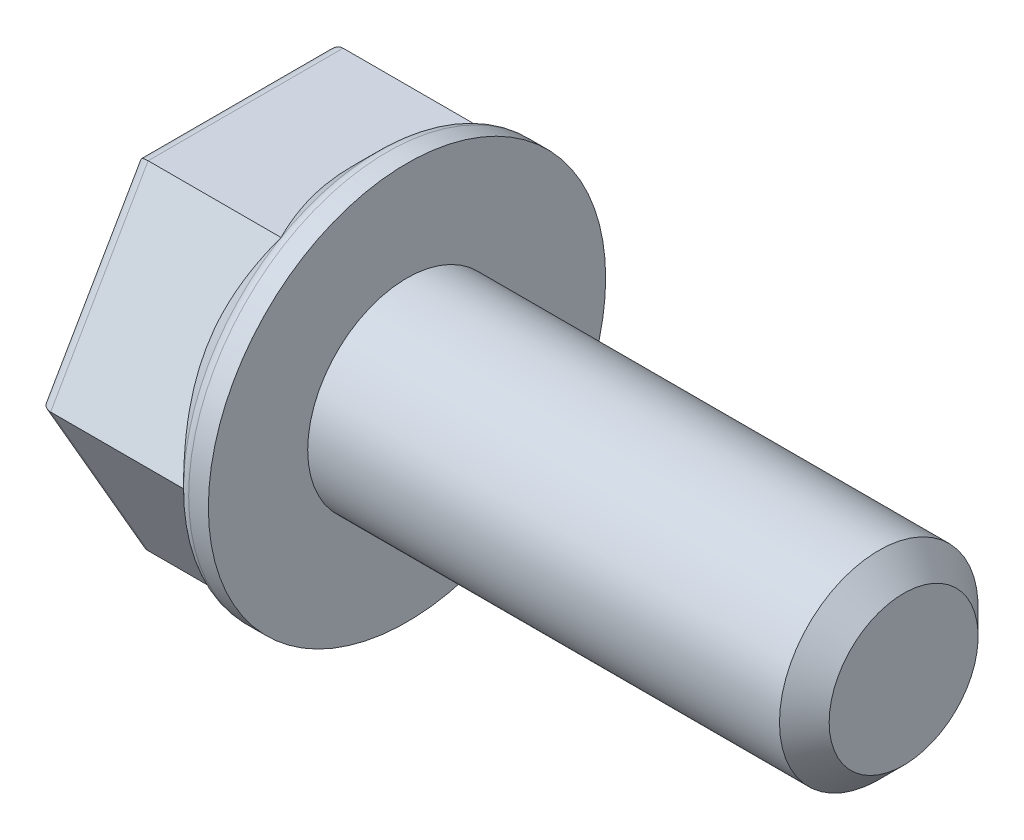
ISO-10303-21;
HEADER;
FILE_DESCRIPTION(('STEP AP214'),'2;1');
FILE_NAME('part.step','',(''),(''),'','','');
FILE_SCHEMA(('AUTOMOTIVE_DESIGN { 1 0 10303 214 1 1 1 1 }'));
ENDSEC;
DATA;
#1=APPLICATION_CONTEXT('core data for automotive mechanical design processes');
#2=APPLICATION_PROTOCOL_DEFINITION('international standard','automotive_design',2000,#1);
#3=PRODUCT_CONTEXT('',#1,'mechanical');
#4=PRODUCT('Part','Part','',(#3));
#5=PRODUCT_RELATED_PRODUCT_CATEGORY('part','',(#4));
#6=PRODUCT_DEFINITION_FORMATION('','',#4);
#7=PRODUCT_DEFINITION_CONTEXT('part definition',#1,'design');
#8=PRODUCT_DEFINITION('design','',#6,#7);
#9=PRODUCT_DEFINITION_SHAPE('','',#8);
#10=(LENGTH_UNIT() NAMED_UNIT(*) SI_UNIT(.MILLI.,.METRE.));
#11=(NAMED_UNIT(*) PLANE_ANGLE_UNIT() SI_UNIT($,.RADIAN.));
#12=(NAMED_UNIT(*) SI_UNIT($,.STERADIAN.) SOLID_ANGLE_UNIT());
#13=UNCERTAINTY_MEASURE_WITH_UNIT(LENGTH_MEASURE(1.E-05),#10,'distance_accuracy_value','');
#14=(GEOMETRIC_REPRESENTATION_CONTEXT(3) GLOBAL_UNCERTAINTY_ASSIGNED_CONTEXT((#13)) GLOBAL_UNIT_ASSIGNED_CONTEXT((#10,
#11,#12)) REPRESENTATION_CONTEXT('',''));
#15=CARTESIAN_POINT('',(0.,0.,0.));
#16=DIRECTION('',(0.,0.,1.));
#17=DIRECTION('',(1.,0.,0.));
#18=AXIS2_PLACEMENT_3D('',#15,#16,#17);
#19=CARTESIAN_POINT('',(-3.5,0.,0.));
#20=DIRECTION('',(-1.,0.,0.));
#21=DIRECTION('',(0.,0.,1.));
#22=AXIS2_PLACEMENT_3D('',#19,#20,#21);
#23=PLANE('',#22);
#24=CARTESIAN_POINT('',(-3.5,0.,0.));
#25=DIRECTION('',(-1.,0.,0.));
#26=DIRECTION('',(0.,0.,1.));
#27=AXIS2_PLACEMENT_3D('',#24,#25,#26);
#28=CIRCLE('',#27,3.10355339059328);
#29=CARTESIAN_POINT('',(-3.5,0.,3.10355339059328));
#30=VERTEX_POINT('',#29);
#31=EDGE_CURVE('E228',#30,#30,#28,.F.);
#32=ORIENTED_EDGE('',*,*,#31,.T.);
#33=EDGE_LOOP('',(#32));
#34=FACE_BOUND('',#33,.T.);
#35=DIRECTION('',(0.,0.,-1.));
#36=VECTOR('',#35,1.);
#37=CARTESIAN_POINT('',(-3.5,3.15000000000002,0.));
#38=LINE('',#37,#36);
#39=CARTESIAN_POINT('',(-3.5,3.15,1.81865334794732));
#40=VERTEX_POINT('',#39);
#41=CARTESIAN_POINT('',(-3.5,3.15000000000004,-1.81865334794721));
#42=VERTEX_POINT('',#41);
#43=EDGE_CURVE('E223',#40,#42,#38,.T.);
#44=ORIENTED_EDGE('',*,*,#43,.T.);
#45=DIRECTION('',(0.,0.866025403784432,0.500000000000012));
#46=VECTOR('',#45,1.);
#47=CARTESIAN_POINT('',(-3.5,-0.125000000000003,-3.70947547954332));
#48=LINE('',#47,#46);
#49=CARTESIAN_POINT('',(-3.5,0.,-3.63730669589461));
#50=VERTEX_POINT('',#49);
#51=EDGE_CURVE('E225',#42,#50,#48,.F.);
#52=ORIENTED_EDGE('',*,*,#51,.T.);
#53=DIRECTION('',(0.,-0.866025403784432,0.500000000000012));
#54=VECTOR('',#53,1.);
#55=CARTESIAN_POINT('',(-3.5,-1.57500000000001,-2.72798002192092));
#56=LINE('',#55,#54);
#57=CARTESIAN_POINT('',(-3.5,-3.15000000000004,-1.81865334794721));
#58=VERTEX_POINT('',#57);
#59=EDGE_CURVE('E209',#50,#58,#56,.T.);
#60=ORIENTED_EDGE('',*,*,#59,.T.);
#61=DIRECTION('',(0.,0.,-1.));
#62=VECTOR('',#61,1.);
#63=CARTESIAN_POINT('',(-3.5,-3.15,1.96299091524473));
#64=LINE('',#63,#62);
#65=CARTESIAN_POINT('',(-3.5,-3.15,1.81865334794732));
#66=VERTEX_POINT('',#65);
#67=EDGE_CURVE('E212',#58,#66,#64,.F.);
#68=ORIENTED_EDGE('',*,*,#67,.T.);
#69=DIRECTION('',(0.,-0.86602540378444,-0.499999999999998));
#70=VECTOR('',#69,1.);
#71=CARTESIAN_POINT('',(-3.5,0.125,3.70947547954334));
#72=LINE('',#71,#70);
#73=CARTESIAN_POINT('',(-3.5,0.,3.63730669589464));
#74=VERTEX_POINT('',#73);
#75=EDGE_CURVE('E219',#66,#74,#72,.F.);
#76=ORIENTED_EDGE('',*,*,#75,.T.);
#77=DIRECTION('',(0.,0.86602540378444,-0.499999999999998));
#78=VECTOR('',#77,1.);
#79=CARTESIAN_POINT('',(-3.5,1.57499999999999,2.72798002192098));
#80=LINE('',#79,#78);
#81=EDGE_CURVE('E221',#74,#40,#80,.T.);
#82=ORIENTED_EDGE('',*,*,#81,.T.);
#83=EDGE_LOOP('',(#44,#52,#60,#68,#76,#82));
#84=FACE_BOUND('',#83,.T.);
#85=ADVANCED_FACE('F33',(#34,#84),#23,.T.);
#86=CARTESIAN_POINT('',(-1.5,0.,0.));
#87=DIRECTION('',(1.,0.,0.));
#88=DIRECTION('',(0.,0.,-1.));
#89=AXIS2_PLACEMENT_3D('',#86,#87,#88);
#90=CONICAL_SURFACE('',#89,3.,0.785398163397448);
#91=CARTESIAN_POINT('',(-0.573223304703364,0.,0.));
#92=DIRECTION('',(-1.,0.,0.));
#93=DIRECTION('',(0.,0.,1.));
#94=AXIS2_PLACEMENT_3D('',#91,#92,#93);
#95=CIRCLE('',#94,3.92677669529664);
#96=CARTESIAN_POINT('',(-0.573223304703364,0.,3.92677669529664));
#97=VERTEX_POINT('',#96);
#98=EDGE_CURVE('E42',#97,#97,#95,.T.);
#99=ORIENTED_EDGE('',*,*,#98,.T.);
#100=EDGE_LOOP('',(#99));
#101=FACE_BOUND('',#100,.T.);
#102=CARTESIAN_POINT('',(-0.573902694362622,0.0002,-3.92609730054327));
#103=CARTESIAN_POINT('',(-0.641319758876492,-0.116671709239921,-3.85862138775294));
#104=CARTESIAN_POINT('',(-0.704777190544404,-0.23549764934872,-3.79001719924442));
#105=CARTESIAN_POINT('',(-0.820966008889542,-0.47779664226543,-3.65012581045957));
#106=CARTESIAN_POINT('',(-0.873632752459418,-0.60129273572407,-3.57882530765736));
#107=CARTESIAN_POINT('',(-0.963851791615953,-0.850316657708434,-3.43505127926502));
#108=CARTESIAN_POINT('',(-1.00163083721008,-0.975781073624979,-3.36261436496189));
#109=CARTESIAN_POINT('',(-1.05983713719325,-1.22947191716903,-3.21614588815078));
#110=CARTESIAN_POINT('',(-1.08030783771892,-1.35769059578066,-3.14211879953922));
#111=CARTESIAN_POINT('',(-1.09877789609952,-1.57867115649286,-3.01453561332635));
#112=CARTESIAN_POINT('',(-1.10151193618797,-1.67114767697622,-2.96114426933156));
#113=CARTESIAN_POINT('',(-1.09690453263237,-1.85595028659457,-2.85444843292146));
#114=CARTESIAN_POINT('',(-1.08955955690715,-1.94827631163644,-2.80114397751032));
#115=CARTESIAN_POINT('',(-1.06521350801733,-2.13205366509338,-2.695040073021));
#116=CARTESIAN_POINT('',(-1.04820163442915,-2.22350389861693,-2.64224125607872));
#117=CARTESIAN_POINT('',(-1.0054503224036,-2.40483373903244,-2.53755042390271));
#118=CARTESIAN_POINT('',(-0.979711553098989,-2.49471346578722,-2.48565833946615));
#119=CARTESIAN_POINT('',(-0.926755657018568,-2.65427457180042,-2.39353569195723));
#120=CARTESIAN_POINT('',(-0.900930660920208,-2.72430916013171,-2.35310120353157));
#121=CARTESIAN_POINT('',(-0.845118612352975,-2.8631210352198,-2.27295813008274));
#122=CARTESIAN_POINT('',(-0.815131433070695,-2.93189828359568,-2.23324956721881));
#123=CARTESIAN_POINT('',(-0.751667298140209,-3.06797879661051,-2.15468344639823));
#124=CARTESIAN_POINT('',(-0.71820131611684,-3.13528593168419,-2.11582365384506));
#125=CARTESIAN_POINT('',(-0.648219071444567,-3.26865369722879,-2.03882373850666));
#126=CARTESIAN_POINT('',(-0.611704680550774,-3.33471506250691,-2.0006831914803));
#127=CARTESIAN_POINT('',(-0.573902694362616,-3.40020000000004,-1.96287544519078));
#128=B_SPLINE_CURVE_WITH_KNOTS('',3,(#102,#103,#104,#105,#106,#107,#108,#109,#110,#111,#112,
#113,#114,#115,#116,#117,#118,#119,#120,#121,#122,#123,#124,#125,#126,#127),.UNSPECIFIED.,.F.,
.F.,(4,2,2,2,2,2,2,2,2,2,2,2,4),(0.,0.452876735015739,0.9083919014334,1.35667302009806,
1.80382552734873,2.12382555955117,2.44393776091786,2.76440831553422,3.08485430369785,
3.33941214437049,3.59397774261522,3.84776339153715,4.10139434359157),.UNSPECIFIED.);
#129=CARTESIAN_POINT('',(-0.574018169510578,0.,-3.92598183048943));
#130=VERTEX_POINT('',#129);
#131=CARTESIAN_POINT('',(-0.574018169510572,-3.40000000000004,-1.96299091524461));
#132=VERTEX_POINT('',#131);
#133=EDGE_CURVE('E167',#130,#132,#128,.T.);
#134=ORIENTED_EDGE('',*,*,#133,.F.);
#135=CARTESIAN_POINT('',(-0.573902694362622,-0.0002,-3.92609730054327));
#136=CARTESIAN_POINT('',(-0.641319758876492,0.116671709239921,-3.85862138775294));
#137=CARTESIAN_POINT('',(-0.704777190544404,0.23549764934872,-3.79001719924442));
#138=CARTESIAN_POINT('',(-0.820966008889542,0.47779664226543,-3.65012581045957));
#139=CARTESIAN_POINT('',(-0.873632752459418,0.60129273572407,-3.57882530765736));
#140=CARTESIAN_POINT('',(-0.963851791615953,0.850316657708434,-3.43505127926502));
#141=CARTESIAN_POINT('',(-1.00163083721008,0.975781073624979,-3.36261436496189));
#142=CARTESIAN_POINT('',(-1.05983713719325,1.22947191716903,-3.21614588815078));
#143=CARTESIAN_POINT('',(-1.08030783771892,1.35769059578066,-3.14211879953922));
#144=CARTESIAN_POINT('',(-1.09877789609952,1.57867115649286,-3.01453561332635));
#145=CARTESIAN_POINT('',(-1.10151193618797,1.67114767697622,-2.96114426933156));
#146=CARTESIAN_POINT('',(-1.09690453263237,1.85595028659457,-2.85444843292146));
#147=CARTESIAN_POINT('',(-1.08955955690715,1.94827631163644,-2.80114397751032));
#148=CARTESIAN_POINT('',(-1.06521350801733,2.13205366509338,-2.695040073021));
#149=CARTESIAN_POINT('',(-1.04820163442915,2.22350389861693,-2.64224125607872));
#150=CARTESIAN_POINT('',(-1.0054503224036,2.40483373903244,-2.53755042390271));
#151=CARTESIAN_POINT('',(-0.979711553098989,2.49471346578722,-2.48565833946615));
#152=CARTESIAN_POINT('',(-0.926755657018568,2.65427457180042,-2.39353569195723));
#153=CARTESIAN_POINT('',(-0.900930660920208,2.72430916013171,-2.35310120353157));
#154=CARTESIAN_POINT('',(-0.845118612352975,2.8631210352198,-2.27295813008274));
#155=CARTESIAN_POINT('',(-0.815131433070695,2.93189828359568,-2.23324956721881));
#156=CARTESIAN_POINT('',(-0.751667298140209,3.06797879661051,-2.15468344639823));
#157=CARTESIAN_POINT('',(-0.71820131611684,3.13528593168419,-2.11582365384506));
#158=CARTESIAN_POINT('',(-0.648219071444567,3.26865369722879,-2.03882373850666));
#159=CARTESIAN_POINT('',(-0.611704680550774,3.33471506250691,-2.0006831914803));
#160=CARTESIAN_POINT('',(-0.573902694362616,3.40020000000004,-1.96287544519078));
#161=B_SPLINE_CURVE_WITH_KNOTS('',3,(#135,#136,#137,#138,#139,#140,#141,#142,#143,#144,#145,
#146,#147,#148,#149,#150,#151,#152,#153,#154,#155,#156,#157,#158,#159,#160),.UNSPECIFIED.,.F.,
.F.,(4,2,2,2,2,2,2,2,2,2,2,2,4),(0.,0.452876735015739,0.9083919014334,1.35667302009806,
1.80382552734873,2.12382555955117,2.44393776091786,2.76440831553422,3.08485430369785,
3.33941214437049,3.59397774261522,3.84776339153715,4.10139434359157),.UNSPECIFIED.);
#162=CARTESIAN_POINT('',(-0.574018169510571,3.40000000000004,-1.96299091524461));
#163=VERTEX_POINT('',#162);
#164=EDGE_CURVE('E161',#130,#163,#161,.T.);
#165=ORIENTED_EDGE('',*,*,#164,.T.);
#166=CARTESIAN_POINT('',(0.724042701609277,3.40000000000006,-3.96618483535964));
#167=CARTESIAN_POINT('',(0.650912455356699,3.40000000000006,-3.86983982106733));
#168=CARTESIAN_POINT('',(0.578473956927214,3.40000000000006,-3.7729611402419));
#169=CARTESIAN_POINT('',(0.435291992571339,3.40000000000006,-3.57792374002367));
#170=CARTESIAN_POINT('',(0.364548949451016,3.40000000000006,-3.47976471057569));
#171=CARTESIAN_POINT('',(0.224566113989496,3.40000000000005,-3.28123579586413));
#172=CARTESIAN_POINT('',(0.155342198625742,3.40000000000005,-3.18085467804542));
#173=CARTESIAN_POINT('',(0.0194269661665651,3.40000000000005,-2.97839764899635));
#174=CARTESIAN_POINT('',(-0.0472645284602962,3.40000000000005,-2.87632185729217));
#175=CARTESIAN_POINT('',(-0.18138517789537,3.40000000000005,-2.66413015927164));
#176=CARTESIAN_POINT('',(-0.248626365673899,3.40000000000005,-2.55389483966336));
#177=CARTESIAN_POINT('',(-0.378758057594365,3.40000000000004,-2.33084584915667));
#178=CARTESIAN_POINT('',(-0.441647860193126,3.40000000000004,-2.21803176638487));
#179=CARTESIAN_POINT('',(-0.561724749964569,3.40000000000004,-1.98982394567069));
#180=CARTESIAN_POINT('',(-0.618928602852984,3.40000000000004,-1.87443909900825));
#181=CARTESIAN_POINT('',(-0.726352619768343,3.40000000000004,-1.64048900369384));
#182=CARTESIAN_POINT('',(-0.776575984331969,3.40000000000004,-1.52192524251057));
#183=CARTESIAN_POINT('',(-0.864306929196451,3.40000000000003,-1.29173731254495));
#184=CARTESIAN_POINT('',(-0.902535921111214,3.40000000000003,-1.18039095528623));
#185=CARTESIAN_POINT('',(-0.970067773649302,3.40000000000003,-0.954972737351087));
#186=CARTESIAN_POINT('',(-0.999370033397084,3.40000000000003,-0.840900693760572));
#187=CARTESIAN_POINT('',(-1.04701510450047,3.40000000000003,-0.612634447033377));
#188=CARTESIAN_POINT('',(-1.06554884871594,3.40000000000003,-0.498480762754464));
#189=CARTESIAN_POINT('',(-1.09128902203404,3.40000000000002,-0.268896545502124));
#190=CARTESIAN_POINT('',(-1.09849750672046,3.40000000000002,-0.153466248070593));
#191=CARTESIAN_POINT('',(-1.10102911358504,3.40000000000002,0.0731088357087862));
#192=CARTESIAN_POINT('',(-1.09679596955608,3.40000000000002,0.18424879529163));
#193=CARTESIAN_POINT('',(-1.07766937131477,3.40000000000002,0.40560151158034));
#194=CARTESIAN_POINT('',(-1.06277489930059,3.40000000000002,0.515814178744207));
#195=CARTESIAN_POINT('',(-1.02289334346172,3.40000000000001,0.736378963641851));
#196=CARTESIAN_POINT('',(-0.997732705646114,3.40000000000001,0.846699185675399));
#197=CARTESIAN_POINT('',(-0.938675913144419,3.40000000000001,1.06492923181437));
#198=CARTESIAN_POINT('',(-0.904780424521525,3.40000000000001,1.1728392390257));
#199=CARTESIAN_POINT('',(-0.826580177802626,3.40000000000001,1.39488118327726));
#200=CARTESIAN_POINT('',(-0.7816462037869,3.4,1.50878918486041));
#201=CARTESIAN_POINT('',(-0.684871694999256,3.4,1.73364085667119));
#202=CARTESIAN_POINT('',(-0.633028876021696,3.4,1.84458353187395));
#203=CARTESIAN_POINT('',(-0.523660407123388,3.4,2.06406368926325));
#204=CARTESIAN_POINT('',(-0.466116663439113,3.4,2.17259208191687));
#205=CARTESIAN_POINT('',(-0.346619367071198,3.4,2.38715476490012));
#206=CARTESIAN_POINT('',(-0.284666508762507,3.39999999999999,2.49318944447124));
#207=CARTESIAN_POINT('',(-0.160379089876663,3.39999999999999,2.69788580410557));
#208=CARTESIAN_POINT('',(-0.0982161030184111,3.39999999999999,2.7966522130158));
#209=CARTESIAN_POINT('',(0.0287343293433039,3.39999999999999,2.99248898336318));
#210=CARTESIAN_POINT('',(0.0935219730469526,3.39999999999999,3.08955921591887));
#211=CARTESIAN_POINT('',(0.224720183543136,3.39999999999999,3.28144047509748));
#212=CARTESIAN_POINT('',(0.291113369683844,3.39999999999999,3.37626342846166));
#213=CARTESIAN_POINT('',(0.425663317487626,3.39999999999998,3.56461182046785));
#214=CARTESIAN_POINT('',(0.493819588692102,3.39999999999998,3.65813760906975));
#215=CARTESIAN_POINT('',(0.562696962289594,3.39999999999998,3.75111990370562));
#216=B_SPLINE_CURVE_WITH_KNOTS('',3,(#166,#167,#168,#169,#170,#171,#172,#173,#174,#175,#176,
#177,#178,#179,#180,#181,#182,#183,#184,#185,#186,#187,#188,#189,#190,#191,#192,#193,#194,#195,
#196,#197,#198,#199,#200,#201,#202,#203,#204,#205,#206,#207,#208,#209,#210,#211,#212,#213,#214,
#215),.UNSPECIFIED.,.F.,.F.,(4,2,2,2,2,2,2,2,2,2,2,2,2,2,2,2,2,2,2,2,2,2,2,2,4),(0.,
0.362875533756704,0.725840637732545,1.0916156182926,1.45736490924445,1.84465932077205,
2.2320160282515,2.61819439496685,3.00419511160231,3.35706531364524,3.70995926281588,
4.05638854252354,4.40275493654567,4.73588304916827,5.06904296867616,5.40808522781044,
5.74710164142205,6.11416815633117,6.48135633343423,6.84974970038573,7.21808517828345,
7.56813839202821,7.9182180893926,8.26546420367837,8.61261473763866),.UNSPECIFIED.);
#217=CARTESIAN_POINT('',(-0.574018169510548,3.4,1.96299091524473));
#218=VERTEX_POINT('',#217);
#219=EDGE_CURVE('E124',#218,#163,#216,.F.);
#220=ORIENTED_EDGE('',*,*,#219,.F.);
#221=CARTESIAN_POINT('',(-0.5739026943626,-0.000199999999999818,3.92609730054329));
#222=CARTESIAN_POINT('',(-0.641319758876466,0.11667170923992,3.85862138775297));
#223=CARTESIAN_POINT('',(-0.704777190544375,0.235497649348718,3.79001719924444));
#224=CARTESIAN_POINT('',(-0.820966008889507,0.477796642265426,3.65012581045961));
#225=CARTESIAN_POINT('',(-0.87363275245938,0.601292735724065,3.5788253076574));
#226=CARTESIAN_POINT('',(-0.963851791615911,0.850316657708427,3.43505127926507));
#227=CARTESIAN_POINT('',(-1.00163083721004,0.97578107362497,3.36261436496193));
#228=CARTESIAN_POINT('',(-1.0598371371932,1.22947191716901,3.21614588815084));
#229=CARTESIAN_POINT('',(-1.08030783771888,1.35769059578065,3.14211879953927));
#230=CARTESIAN_POINT('',(-1.09877789609947,1.57867115649285,3.01453561332641));
#231=CARTESIAN_POINT('',(-1.10151193618792,1.67114767697621,2.96114426933162));
#232=CARTESIAN_POINT('',(-1.09690453263232,1.85595028659456,2.85444843292152));
#233=CARTESIAN_POINT('',(-1.0895595569071,1.94827631163644,2.80114397751039));
#234=CARTESIAN_POINT('',(-1.06521350801728,2.13205366509337,2.69504007302107));
#235=CARTESIAN_POINT('',(-1.04820163442909,2.22350389861693,2.64224125607879));
#236=CARTESIAN_POINT('',(-1.00545032240354,2.40483373903244,2.53755042390278));
#237=CARTESIAN_POINT('',(-0.979711553098935,2.49471346578722,2.48565833946622));
#238=CARTESIAN_POINT('',(-0.926755657018515,2.65427457180042,2.39353569195731));
#239=CARTESIAN_POINT('',(-0.900930660920156,2.72430916013171,2.35310120353165));
#240=CARTESIAN_POINT('',(-0.845118612352927,2.86312103521979,2.27295813008283));
#241=CARTESIAN_POINT('',(-0.81513143307065,2.93189828359567,2.2332495672189));
#242=CARTESIAN_POINT('',(-0.75166729814017,3.06797879661048,2.15468344639833));
#243=CARTESIAN_POINT('',(-0.718201316116804,3.13528593168416,2.11582365384516));
#244=CARTESIAN_POINT('',(-0.648219071444537,3.26865369722876,2.03882373850677));
#245=CARTESIAN_POINT('',(-0.611704680550747,3.33471506250688,2.00068319148041));
#246=CARTESIAN_POINT('',(-0.573902694362592,3.4002,1.96287544519089));
#247=B_SPLINE_CURVE_WITH_KNOTS('',3,(#221,#222,#223,#224,#225,#226,#227,#228,#229,#230,#231,
#232,#233,#234,#235,#236,#237,#238,#239,#240,#241,#242,#243,#244,#245,#246),.UNSPECIFIED.,.F.,
.F.,(4,2,2,2,2,2,2,2,2,2,2,2,4),(0.,0.452876735015729,0.90839190143338,1.35667302009803,
1.80382552734869,2.12382555955113,2.44393776091783,2.76440831553419,3.08485430369783,
3.33941214437045,3.59397774261515,3.84776339153707,4.10139434359147),.UNSPECIFIED.);
#248=CARTESIAN_POINT('',(-0.574018169510555,0.,3.92598183048945));
#249=VERTEX_POINT('',#248);
#250=EDGE_CURVE('E122',#249,#218,#247,.T.);
#251=ORIENTED_EDGE('',*,*,#250,.F.);
#252=CARTESIAN_POINT('',(-0.5739026943626,0.000200000000000252,3.92609730054329));
#253=CARTESIAN_POINT('',(-0.641319758876466,-0.11667170923992,3.85862138775297));
#254=CARTESIAN_POINT('',(-0.704777190544375,-0.235497649348718,3.79001719924444));
#255=CARTESIAN_POINT('',(-0.820966008889508,-0.477796642265426,3.65012581045961));
#256=CARTESIAN_POINT('',(-0.873632752459381,-0.601292735724065,3.5788253076574));
#257=CARTESIAN_POINT('',(-0.963851791615911,-0.850316657708427,3.43505127926507));
#258=CARTESIAN_POINT('',(-1.00163083721004,-0.97578107362497,3.36261436496193));
#259=CARTESIAN_POINT('',(-1.0598371371932,-1.22947191716901,3.21614588815084));
#260=CARTESIAN_POINT('',(-1.08030783771888,-1.35769059578065,3.14211879953927));
#261=CARTESIAN_POINT('',(-1.09877789609947,-1.57867115649285,3.01453561332641));
#262=CARTESIAN_POINT('',(-1.10151193618792,-1.67114767697621,2.96114426933162));
#263=CARTESIAN_POINT('',(-1.09690453263232,-1.85595028659456,2.85444843292152));
#264=CARTESIAN_POINT('',(-1.0895595569071,-1.94827631163644,2.80114397751039));
#265=CARTESIAN_POINT('',(-1.06521350801728,-2.13205366509338,2.69504007302107));
#266=CARTESIAN_POINT('',(-1.04820163442909,-2.22350389861693,2.64224125607879));
#267=CARTESIAN_POINT('',(-1.00545032240354,-2.40483373903244,2.53755042390278));
#268=CARTESIAN_POINT('',(-0.979711553098935,-2.49471346578722,2.48565833946622));
#269=CARTESIAN_POINT('',(-0.926755657018514,-2.65427457180042,2.39353569195731));
#270=CARTESIAN_POINT('',(-0.900930660920156,-2.72430916013171,2.35310120353165));
#271=CARTESIAN_POINT('',(-0.845118612352927,-2.86312103521979,2.27295813008283));
#272=CARTESIAN_POINT('',(-0.81513143307065,-2.93189828359567,2.2332495672189));
#273=CARTESIAN_POINT('',(-0.751667298140169,-3.06797879661048,2.15468344639833));
#274=CARTESIAN_POINT('',(-0.718201316116804,-3.13528593168417,2.11582365384516));
#275=CARTESIAN_POINT('',(-0.648219071444537,-3.26865369722876,2.03882373850677));
#276=CARTESIAN_POINT('',(-0.611704680550747,-3.33471506250688,2.00068319148041));
#277=CARTESIAN_POINT('',(-0.573902694362592,-3.4002,1.96287544519089));
#278=B_SPLINE_CURVE_WITH_KNOTS('',3,(#252,#253,#254,#255,#256,#257,#258,#259,#260,#261,#262,
#263,#264,#265,#266,#267,#268,#269,#270,#271,#272,#273,#274,#275,#276,#277),.UNSPECIFIED.,.F.,
.F.,(4,2,2,2,2,2,2,2,2,2,2,2,4),(0.,0.452876735015729,0.90839190143338,1.35667302009803,
1.80382552734869,2.12382555955113,2.44393776091783,2.7644083155342,3.08485430369783,
3.33941214437045,3.59397774261516,3.84776339153707,4.10139434359147),.UNSPECIFIED.);
#279=CARTESIAN_POINT('',(-0.574018169510548,-3.4,1.96299091524473));
#280=VERTEX_POINT('',#279);
#281=EDGE_CURVE('E114',#249,#280,#278,.T.);
#282=ORIENTED_EDGE('',*,*,#281,.T.);
#283=CARTESIAN_POINT('',(0.724042701609277,-3.40000000000006,-3.96618483535964));
#284=CARTESIAN_POINT('',(0.650912455356699,-3.40000000000006,-3.86983982106733));
#285=CARTESIAN_POINT('',(0.578473956927214,-3.40000000000006,-3.7729611402419));
#286=CARTESIAN_POINT('',(0.435291992571339,-3.40000000000006,-3.57792374002367));
#287=CARTESIAN_POINT('',(0.364548949451016,-3.40000000000006,-3.47976471057569));
#288=CARTESIAN_POINT('',(0.224566113989496,-3.40000000000005,-3.28123579586413));
#289=CARTESIAN_POINT('',(0.155342198625742,-3.40000000000005,-3.18085467804542));
#290=CARTESIAN_POINT('',(0.0194269661665651,-3.40000000000005,-2.97839764899635));
#291=CARTESIAN_POINT('',(-0.0472645284602962,-3.40000000000005,-2.87632185729217));
#292=CARTESIAN_POINT('',(-0.18138517789537,-3.40000000000005,-2.66413015927164));
#293=CARTESIAN_POINT('',(-0.248626365673899,-3.40000000000005,-2.55389483966336));
#294=CARTESIAN_POINT('',(-0.378758057594365,-3.40000000000004,-2.33084584915667));
#295=CARTESIAN_POINT('',(-0.441647860193126,-3.40000000000004,-2.21803176638487));
#296=CARTESIAN_POINT('',(-0.561724749964569,-3.40000000000004,-1.98982394567069));
#297=CARTESIAN_POINT('',(-0.618928602852984,-3.40000000000004,-1.87443909900825));
#298=CARTESIAN_POINT('',(-0.726352619768343,-3.40000000000004,-1.64048900369384));
#299=CARTESIAN_POINT('',(-0.776575984331969,-3.40000000000004,-1.52192524251057));
#300=CARTESIAN_POINT('',(-0.864306929196451,-3.40000000000003,-1.29173731254495));
#301=CARTESIAN_POINT('',(-0.902535921111214,-3.40000000000003,-1.18039095528623));
#302=CARTESIAN_POINT('',(-0.970067773649302,-3.40000000000003,-0.954972737351087));
#303=CARTESIAN_POINT('',(-0.999370033397084,-3.40000000000003,-0.840900693760572));
#304=CARTESIAN_POINT('',(-1.04701510450047,-3.40000000000003,-0.612634447033377));
#305=CARTESIAN_POINT('',(-1.06554884871594,-3.40000000000003,-0.498480762754464));
#306=CARTESIAN_POINT('',(-1.09128902203404,-3.40000000000002,-0.268896545502124));
#307=CARTESIAN_POINT('',(-1.09849750672046,-3.40000000000002,-0.153466248070593));
#308=CARTESIAN_POINT('',(-1.10102911358504,-3.40000000000002,0.0731088357087862));
#309=CARTESIAN_POINT('',(-1.09679596955608,-3.40000000000002,0.18424879529163));
#310=CARTESIAN_POINT('',(-1.07766937131477,-3.40000000000002,0.40560151158034));
#311=CARTESIAN_POINT('',(-1.06277489930059,-3.40000000000002,0.515814178744207));
#312=CARTESIAN_POINT('',(-1.02289334346172,-3.40000000000001,0.736378963641851));
#313=CARTESIAN_POINT('',(-0.997732705646114,-3.40000000000001,0.846699185675399));
#314=CARTESIAN_POINT('',(-0.938675913144419,-3.40000000000001,1.06492923181437));
#315=CARTESIAN_POINT('',(-0.904780424521525,-3.40000000000001,1.1728392390257));
#316=CARTESIAN_POINT('',(-0.826580177802626,-3.40000000000001,1.39488118327726));
#317=CARTESIAN_POINT('',(-0.7816462037869,-3.4,1.50878918486041));
#318=CARTESIAN_POINT('',(-0.684871694999256,-3.4,1.73364085667119));
#319=CARTESIAN_POINT('',(-0.633028876021696,-3.4,1.84458353187395));
#320=CARTESIAN_POINT('',(-0.523660407123388,-3.4,2.06406368926325));
#321=CARTESIAN_POINT('',(-0.466116663439113,-3.4,2.17259208191687));
#322=CARTESIAN_POINT('',(-0.346619367071198,-3.4,2.38715476490012));
#323=CARTESIAN_POINT('',(-0.284666508762507,-3.39999999999999,2.49318944447124));
#324=CARTESIAN_POINT('',(-0.160379089876663,-3.39999999999999,2.69788580410557));
#325=CARTESIAN_POINT('',(-0.0982161030184111,-3.39999999999999,2.7966522130158));
#326=CARTESIAN_POINT('',(0.0287343293433039,-3.39999999999999,2.99248898336318));
#327=CARTESIAN_POINT('',(0.0935219730469526,-3.39999999999999,3.08955921591887));
#328=CARTESIAN_POINT('',(0.224720183543136,-3.39999999999999,3.28144047509748));
#329=CARTESIAN_POINT('',(0.291113369683844,-3.39999999999999,3.37626342846166));
#330=CARTESIAN_POINT('',(0.425663317487626,-3.39999999999998,3.56461182046785));
#331=CARTESIAN_POINT('',(0.493819588692102,-3.39999999999998,3.65813760906975));
#332=CARTESIAN_POINT('',(0.562696962289594,-3.39999999999998,3.75111990370562));
#333=B_SPLINE_CURVE_WITH_KNOTS('',3,(#283,#284,#285,#286,#287,#288,#289,#290,#291,#292,#293,
#294,#295,#296,#297,#298,#299,#300,#301,#302,#303,#304,#305,#306,#307,#308,#309,#310,#311,#312,
#313,#314,#315,#316,#317,#318,#319,#320,#321,#322,#323,#324,#325,#326,#327,#328,#329,#330,#331,
#332),.UNSPECIFIED.,.F.,.F.,(4,2,2,2,2,2,2,2,2,2,2,2,2,2,2,2,2,2,2,2,2,2,2,2,4),(0.,
0.362875533756704,0.725840637732545,1.0916156182926,1.45736490924445,1.84465932077205,
2.2320160282515,2.61819439496685,3.00419511160231,3.35706531364524,3.70995926281588,
4.05638854252354,4.40275493654567,4.73588304916827,5.06904296867616,5.40808522781044,
5.74710164142205,6.11416815633117,6.48135633343423,6.84974970038573,7.21808517828345,
7.56813839202821,7.9182180893926,8.26546420367837,8.61261473763866),.UNSPECIFIED.);
#334=EDGE_CURVE('E105',#280,#132,#333,.F.);
#335=ORIENTED_EDGE('',*,*,#334,.T.);
#336=EDGE_LOOP('',(#134,#165,#220,#251,#282,#335));
#337=FACE_BOUND('',#336,.T.);
#338=ADVANCED_FACE('F35',(#101,#337),#90,.T.);
#339=CARTESIAN_POINT('',(-16.,0.,0.));
#340=DIRECTION('',(-1.,0.,0.));
#341=DIRECTION('',(0.,0.,1.));
#342=AXIS2_PLACEMENT_3D('',#339,#340,#341);
#343=CYLINDRICAL_SURFACE('',#342,4.);
#344=CARTESIAN_POINT('',(-0.396446609406728,0.,0.));
#345=DIRECTION('',(1.,0.,0.));
#346=DIRECTION('',(0.,0.,-1.));
#347=AXIS2_PLACEMENT_3D('',#344,#345,#346);
#348=CIRCLE('',#347,4.);
#349=CARTESIAN_POINT('',(-0.396446609406728,0.,-4.));
#350=VERTEX_POINT('',#349);
#351=EDGE_CURVE('E11',#350,#350,#348,.T.);
#352=ORIENTED_EDGE('',*,*,#351,.T.);
#353=EDGE_LOOP('',(#352));
#354=FACE_BOUND('',#353,.T.);
#355=CARTESIAN_POINT('',(0.,0.,0.));
#356=DIRECTION('',(-1.,0.,0.));
#357=DIRECTION('',(0.,0.,1.));
#358=AXIS2_PLACEMENT_3D('',#355,#356,#357);
#359=CIRCLE('',#358,4.);
#360=CARTESIAN_POINT('',(0.,0.,4.));
#361=VERTEX_POINT('',#360);
#362=EDGE_CURVE('E208',#361,#361,#359,.T.);
#363=ORIENTED_EDGE('',*,*,#362,.T.);
#364=EDGE_LOOP('',(#363));
#365=FACE_BOUND('',#364,.T.);
#366=ADVANCED_FACE('F196',(#354,#365),#343,.T.);
#367=CARTESIAN_POINT('',(0.,4.,0.));
#368=DIRECTION('',(1.,0.,0.));
#369=DIRECTION('',(0.,0.,-1.));
#370=AXIS2_PLACEMENT_3D('',#367,#368,#369);
#371=PLANE('',#370);
#372=ORIENTED_EDGE('',*,*,#362,.F.);
#373=EDGE_LOOP('',(#372));
#374=FACE_BOUND('',#373,.T.);
#375=CARTESIAN_POINT('',(0.,0.,0.));
#376=DIRECTION('',(-1.,0.,0.));
#377=DIRECTION('',(0.,0.,1.));
#378=AXIS2_PLACEMENT_3D('',#375,#376,#377);
#379=CIRCLE('',#378,2.);
#380=CARTESIAN_POINT('',(0.,0.,2.));
#381=VERTEX_POINT('',#380);
#382=EDGE_CURVE('E210',#381,#381,#379,.T.);
#383=ORIENTED_EDGE('',*,*,#382,.T.);
#384=EDGE_LOOP('',(#383));
#385=FACE_BOUND('',#384,.T.);
#386=ADVANCED_FACE('F193',(#374,#385),#371,.T.);
#387=CARTESIAN_POINT('',(-16.,0.,0.));
#388=DIRECTION('',(-1.,0.,0.));
#389=DIRECTION('',(0.,0.,1.));
#390=AXIS2_PLACEMENT_3D('',#387,#388,#389);
#391=CYLINDRICAL_SURFACE('',#390,2.);
#392=CARTESIAN_POINT('',(9.50000000000001,0.,0.));
#393=DIRECTION('',(-1.,0.,0.));
#394=DIRECTION('',(0.,0.,1.));
#395=AXIS2_PLACEMENT_3D('',#392,#393,#394);
#396=CIRCLE('',#395,2.);
#397=CARTESIAN_POINT('',(9.50000000000001,0.,2.));
#398=VERTEX_POINT('',#397);
#399=EDGE_CURVE('E215',#398,#398,#396,.T.);
#400=ORIENTED_EDGE('',*,*,#399,.T.);
#401=EDGE_LOOP('',(#400));
#402=FACE_BOUND('',#401,.T.);
#403=ORIENTED_EDGE('',*,*,#382,.F.);
#404=EDGE_LOOP('',(#403));
#405=FACE_BOUND('',#404,.T.);
#406=ADVANCED_FACE('F189',(#402,#405),#391,.T.);
#407=CARTESIAN_POINT('',(9.50000000000001,0.,0.));
#408=DIRECTION('',(-1.,0.,0.));
#409=DIRECTION('',(0.,0.,1.));
#410=AXIS2_PLACEMENT_3D('',#407,#408,#409);
#411=CONICAL_SURFACE('',#410,2.,0.785398163397448);
#412=CARTESIAN_POINT('',(10.,0.,0.));
#413=DIRECTION('',(-1.,0.,0.));
#414=DIRECTION('',(0.,0.,1.));
#415=AXIS2_PLACEMENT_3D('',#412,#413,#414);
#416=CIRCLE('',#415,1.5);
#417=CARTESIAN_POINT('',(10.,0.,1.5));
#418=VERTEX_POINT('',#417);
#419=EDGE_CURVE('E172',#418,#418,#416,.T.);
#420=ORIENTED_EDGE('',*,*,#419,.T.);
#421=EDGE_LOOP('',(#420));
#422=FACE_BOUND('',#421,.T.);
#423=ORIENTED_EDGE('',*,*,#399,.F.);
#424=EDGE_LOOP('',(#423));
#425=FACE_BOUND('',#424,.T.);
#426=ADVANCED_FACE('F185',(#422,#425),#411,.T.);
#427=CARTESIAN_POINT('',(10.,1.5,0.));
#428=DIRECTION('',(1.,0.,0.));
#429=DIRECTION('',(0.,0.,-1.));
#430=AXIS2_PLACEMENT_3D('',#427,#428,#429);
#431=PLANE('',#430);
#432=ORIENTED_EDGE('',*,*,#419,.F.);
#433=EDGE_LOOP('',(#432));
#434=FACE_BOUND('',#433,.T.);
#435=ADVANCED_FACE('F178',(#434),#431,.T.);
#436=CARTESIAN_POINT('',(10.3871715752333,0.,-3.92598183048943));
#437=DIRECTION('',(0.,-0.500000000000012,-0.866025403784432));
#438=DIRECTION('',(0.,0.866025403784432,-0.500000000000012));
#439=AXIS2_PLACEMENT_3D('',#436,#437,#438);
#440=PLANE('',#439);
#441=DIRECTION('',(-1.,0.,0.));
#442=VECTOR('',#441,1.);
#443=CARTESIAN_POINT('',(10.3871715752333,-3.40000000000004,-1.96299091524461));
#444=LINE('',#443,#442);
#445=CARTESIAN_POINT('',(-3.25,-3.40000000000004,-1.96299091524461));
#446=VERTEX_POINT('',#445);
#447=EDGE_CURVE('E109',#132,#446,#444,.T.);
#448=ORIENTED_EDGE('',*,*,#447,.T.);
#449=DIRECTION('',(0.,-0.866025403784432,0.500000000000012));
#450=VECTOR('',#449,1.);
#451=CARTESIAN_POINT('',(-3.25,0.,-3.92598183048943));
#452=LINE('',#451,#450);
#453=CARTESIAN_POINT('',(-3.25,0.,-3.92598183048943));
#454=VERTEX_POINT('',#453);
#455=EDGE_CURVE('E243',#446,#454,#452,.F.);
#456=ORIENTED_EDGE('',*,*,#455,.T.);
#457=DIRECTION('',(-1.,0.,0.));
#458=VECTOR('',#457,1.);
#459=CARTESIAN_POINT('',(10.3871715752333,0.,-3.92598183048943));
#460=LINE('',#459,#458);
#461=EDGE_CURVE('E303',#130,#454,#460,.T.);
#462=ORIENTED_EDGE('',*,*,#461,.F.);
#463=ORIENTED_EDGE('',*,*,#133,.T.);
#464=EDGE_LOOP('',(#448,#456,#462,#463));
#465=FACE_BOUND('',#464,.T.);
#466=ADVANCED_FACE('F174',(#465),#440,.T.);
#467=CARTESIAN_POINT('',(10.3871715752333,0.,-3.92598183048943));
#468=DIRECTION('',(0.,-0.500000000000012,0.866025403784432));
#469=DIRECTION('',(0.,-0.866025403784432,-0.500000000000012));
#470=AXIS2_PLACEMENT_3D('',#467,#468,#469);
#471=PLANE('',#470);
#472=ORIENTED_EDGE('',*,*,#461,.T.);
#473=DIRECTION('',(0.,0.866025403784432,0.500000000000012));
#474=VECTOR('',#473,1.);
#475=CARTESIAN_POINT('',(-3.25,0.,-3.92598183048943));
#476=LINE('',#475,#474);
#477=CARTESIAN_POINT('',(-3.25,3.40000000000004,-1.96299091524461));
#478=VERTEX_POINT('',#477);
#479=EDGE_CURVE('E234',#454,#478,#476,.T.);
#480=ORIENTED_EDGE('',*,*,#479,.T.);
#481=DIRECTION('',(-1.,0.,0.));
#482=VECTOR('',#481,1.);
#483=CARTESIAN_POINT('',(10.3871715752333,3.40000000000004,-1.96299091524461));
#484=LINE('',#483,#482);
#485=EDGE_CURVE('E311',#163,#478,#484,.T.);
#486=ORIENTED_EDGE('',*,*,#485,.F.);
#487=ORIENTED_EDGE('',*,*,#164,.F.);
#488=EDGE_LOOP('',(#472,#480,#486,#487));
#489=FACE_BOUND('',#488,.T.);
#490=ADVANCED_FACE('F153',(#489),#471,.F.);
#491=CARTESIAN_POINT('',(10.3871715752333,3.4,1.96299091524473));
#492=DIRECTION('',(0.,1.,0.));
#493=DIRECTION('',(0.,0.,1.));
#494=AXIS2_PLACEMENT_3D('',#491,#492,#493);
#495=PLANE('',#494);
#496=ORIENTED_EDGE('',*,*,#485,.T.);
#497=DIRECTION('',(0.,0.,-1.));
#498=VECTOR('',#497,1.);
#499=CARTESIAN_POINT('',(-3.25,3.4,1.96299091524473));
#500=LINE('',#499,#498);
#501=CARTESIAN_POINT('',(-3.25,3.4,1.96299091524473));
#502=VERTEX_POINT('',#501);
#503=EDGE_CURVE('E237',#478,#502,#500,.F.);
#504=ORIENTED_EDGE('',*,*,#503,.T.);
#505=DIRECTION('',(-1.,0.,0.));
#506=VECTOR('',#505,1.);
#507=CARTESIAN_POINT('',(10.3871715752333,3.4,1.96299091524473));
#508=LINE('',#507,#506);
#509=EDGE_CURVE('E314',#218,#502,#508,.T.);
#510=ORIENTED_EDGE('',*,*,#509,.F.);
#511=ORIENTED_EDGE('',*,*,#219,.T.);
#512=EDGE_LOOP('',(#496,#504,#510,#511));
#513=FACE_BOUND('',#512,.T.);
#514=ADVANCED_FACE('F148',(#513),#495,.T.);
#515=CARTESIAN_POINT('',(10.3871715752333,0.,3.92598183048945));
#516=DIRECTION('',(0.,0.499999999999998,0.86602540378444));
#517=DIRECTION('',(0.,-0.86602540378444,0.499999999999998));
#518=AXIS2_PLACEMENT_3D('',#515,#516,#517);
#519=PLANE('',#518);
#520=ORIENTED_EDGE('',*,*,#509,.T.);
#521=DIRECTION('',(0.,0.86602540378444,-0.499999999999998));
#522=VECTOR('',#521,1.);
#523=CARTESIAN_POINT('',(-3.25,0.,3.92598183048945));
#524=LINE('',#523,#522);
#525=CARTESIAN_POINT('',(-3.25,0.,3.92598183048945));
#526=VERTEX_POINT('',#525);
#527=EDGE_CURVE('E239',#502,#526,#524,.F.);
#528=ORIENTED_EDGE('',*,*,#527,.T.);
#529=DIRECTION('',(-1.,0.,0.));
#530=VECTOR('',#529,1.);
#531=CARTESIAN_POINT('',(10.3871715752333,0.,3.92598183048945));
#532=LINE('',#531,#530);
#533=EDGE_CURVE('E118',#249,#526,#532,.T.);
#534=ORIENTED_EDGE('',*,*,#533,.F.);
#535=ORIENTED_EDGE('',*,*,#250,.T.);
#536=EDGE_LOOP('',(#520,#528,#534,#535));
#537=FACE_BOUND('',#536,.T.);
#538=ADVANCED_FACE('F142',(#537),#519,.T.);
#539=CARTESIAN_POINT('',(10.3871715752333,0.,3.92598183048945));
#540=DIRECTION('',(0.,0.499999999999998,-0.86602540378444));
#541=DIRECTION('',(0.,0.86602540378444,0.499999999999998));
#542=AXIS2_PLACEMENT_3D('',#539,#540,#541);
#543=PLANE('',#542);
#544=ORIENTED_EDGE('',*,*,#533,.T.);
#545=DIRECTION('',(0.,-0.86602540378444,-0.499999999999998));
#546=VECTOR('',#545,1.);
#547=CARTESIAN_POINT('',(-3.25,0.,3.92598183048945));
#548=LINE('',#547,#546);
#549=CARTESIAN_POINT('',(-3.25,-3.4,1.96299091524473));
#550=VERTEX_POINT('',#549);
#551=EDGE_CURVE('E57',#526,#550,#548,.T.);
#552=ORIENTED_EDGE('',*,*,#551,.T.);
#553=DIRECTION('',(-1.,0.,0.));
#554=VECTOR('',#553,1.);
#555=CARTESIAN_POINT('',(10.3871715752333,-3.4,1.96299091524473));
#556=LINE('',#555,#554);
#557=EDGE_CURVE('E107',#280,#550,#556,.T.);
#558=ORIENTED_EDGE('',*,*,#557,.F.);
#559=ORIENTED_EDGE('',*,*,#281,.F.);
#560=EDGE_LOOP('',(#544,#552,#558,#559));
#561=FACE_BOUND('',#560,.T.);
#562=ADVANCED_FACE('F116',(#561),#543,.F.);
#563=CARTESIAN_POINT('',(10.3871715752333,-3.4,1.96299091524473));
#564=DIRECTION('',(0.,1.,0.));
#565=DIRECTION('',(0.,0.,1.));
#566=AXIS2_PLACEMENT_3D('',#563,#564,#565);
#567=PLANE('',#566);
#568=ORIENTED_EDGE('',*,*,#557,.T.);
#569=DIRECTION('',(0.,0.,-1.));
#570=VECTOR('',#569,1.);
#571=CARTESIAN_POINT('',(-3.25,-3.4,1.96299091524473));
#572=LINE('',#571,#570);
#573=EDGE_CURVE('E49',#550,#446,#572,.T.);
#574=ORIENTED_EDGE('',*,*,#573,.T.);
#575=ORIENTED_EDGE('',*,*,#447,.F.);
#576=ORIENTED_EDGE('',*,*,#334,.F.);
#577=EDGE_LOOP('',(#568,#574,#575,#576));
#578=FACE_BOUND('',#577,.T.);
#579=ADVANCED_FACE('F106',(#578),#567,.F.);
#580=CARTESIAN_POINT('',(-3.07322330470337,0.,0.));
#581=DIRECTION('',(-1.,0.,0.));
#582=DIRECTION('',(0.,0.,1.));
#583=AXIS2_PLACEMENT_3D('',#580,#581,#582);
#584=CONICAL_SURFACE('',#583,2.57322330470337,0.785398163397449);
#585=CARTESIAN_POINT('',(-3.42677669529664,0.,0.));
#586=DIRECTION('',(1.,0.,0.));
#587=DIRECTION('',(0.,0.,-1.));
#588=AXIS2_PLACEMENT_3D('',#585,#586,#587);
#589=CIRCLE('',#588,2.92677669529664);
#590=CARTESIAN_POINT('',(-3.42677669529664,0.,-2.92677669529664));
#591=VERTEX_POINT('',#590);
#592=EDGE_CURVE('E231',#591,#591,#589,.F.);
#593=ORIENTED_EDGE('',*,*,#592,.T.);
#594=EDGE_LOOP('',(#593));
#595=FACE_BOUND('',#594,.T.);
#596=CARTESIAN_POINT('',(-3.07322330470337,0.,0.));
#597=DIRECTION('',(-1.,0.,0.));
#598=DIRECTION('',(0.,0.,1.));
#599=AXIS2_PLACEMENT_3D('',#596,#597,#598);
#600=CIRCLE('',#599,2.57322330470337);
#601=CARTESIAN_POINT('',(-3.07322330470337,0.,2.57322330470337));
#602=VERTEX_POINT('',#601);
#603=EDGE_CURVE('E299',#602,#602,#600,.T.);
#604=ORIENTED_EDGE('',*,*,#603,.F.);
#605=EDGE_LOOP('',(#604));
#606=FACE_BOUND('',#605,.T.);
#607=ADVANCED_FACE('F288',(#595,#606),#584,.F.);
#608=CARTESIAN_POINT('',(-3.42677669529664,0.,0.));
#609=DIRECTION('',(-1.,0.,0.));
#610=DIRECTION('',(0.,0.,1.));
#611=AXIS2_PLACEMENT_3D('',#608,#609,#610);
#612=TOROIDAL_SURFACE('',#611,2.21966991411009,0.5);
#613=CARTESIAN_POINT('',(-2.92677669529664,0.,0.));
#614=DIRECTION('',(-1.,0.,0.));
#615=DIRECTION('',(0.,0.,1.));
#616=AXIS2_PLACEMENT_3D('',#613,#614,#615);
#617=CIRCLE('',#616,2.21966991411009);
#618=CARTESIAN_POINT('',(-2.92677669529664,0.,2.21966991411009));
#619=VERTEX_POINT('',#618);
#620=EDGE_CURVE('E301',#619,#619,#617,.T.);
#621=ORIENTED_EDGE('',*,*,#620,.F.);
#622=EDGE_LOOP('',(#621));
#623=FACE_BOUND('',#622,.T.);
#624=ORIENTED_EDGE('',*,*,#603,.T.);
#625=EDGE_LOOP('',(#624));
#626=FACE_BOUND('',#625,.T.);
#627=ADVANCED_FACE('F285',(#623,#626),#612,.F.);
#628=CARTESIAN_POINT('',(-2.92677669529664,2.21966991411009,0.));
#629=DIRECTION('',(1.,0.,0.));
#630=DIRECTION('',(0.,0.,-1.));
#631=AXIS2_PLACEMENT_3D('',#628,#629,#630);
#632=PLANE('',#631);
#633=ORIENTED_EDGE('',*,*,#620,.T.);
#634=EDGE_LOOP('',(#633));
#635=FACE_BOUND('',#634,.T.);
#636=ADVANCED_FACE('F281',(#635),#632,.F.);
#637=CARTESIAN_POINT('',(-3.25,0.,0.));
#638=DIRECTION('',(-1.,0.,0.));
#639=DIRECTION('',(0.,0.,1.));
#640=AXIS2_PLACEMENT_3D('',#637,#638,#639);
#641=TOROIDAL_SURFACE('',#640,3.10355339059328,0.25);
#642=ORIENTED_EDGE('',*,*,#592,.F.);
#643=EDGE_LOOP('',(#642));
#644=FACE_BOUND('',#643,.T.);
#645=ORIENTED_EDGE('',*,*,#31,.F.);
#646=EDGE_LOOP('',(#645));
#647=FACE_BOUND('',#646,.T.);
#648=ADVANCED_FACE('F277',(#644,#647),#641,.T.);
#649=CARTESIAN_POINT('',(-3.25,0.125,3.70947547954334));
#650=DIRECTION('',(0.,0.86602540378444,0.499999999999998));
#651=DIRECTION('',(0.,-0.499999999999998,0.86602540378444));
#652=AXIS2_PLACEMENT_3D('',#649,#650,#651);
#653=CYLINDRICAL_SURFACE('',#652,0.25);
#654=CARTESIAN_POINT('',(-3.25,0.,3.63730669589464));
#655=DIRECTION('',(0.,1.,0.));
#656=DIRECTION('',(0.,0.,1.));
#657=AXIS2_PLACEMENT_3D('',#654,#655,#656);
#658=ELLIPSE('',#657,0.288675134594813,0.25);
#659=EDGE_CURVE('E320',#74,#526,#658,.T.);
#660=ORIENTED_EDGE('',*,*,#659,.F.);
#661=ORIENTED_EDGE('',*,*,#75,.F.);
#662=CARTESIAN_POINT('',(-3.25,-3.15,1.81865334794732));
#663=DIRECTION('',(0.,0.500000000000005,0.866025403784436));
#664=DIRECTION('',(0.,-0.866025403784436,0.500000000000005));
#665=AXIS2_PLACEMENT_3D('',#662,#663,#664);
#666=ELLIPSE('',#665,0.288675134594812,0.25);
#667=EDGE_CURVE('E305',#550,#66,#666,.F.);
#668=ORIENTED_EDGE('',*,*,#667,.F.);
#669=ORIENTED_EDGE('',*,*,#551,.F.);
#670=EDGE_LOOP('',(#660,#661,#668,#669));
#671=FACE_BOUND('',#670,.T.);
#672=ADVANCED_FACE('F273',(#671),#653,.T.);
#673=CARTESIAN_POINT('',(-3.25,-3.15,1.96299091524473));
#674=DIRECTION('',(0.,0.,1.));
#675=DIRECTION('',(0.,-1.,0.));
#676=AXIS2_PLACEMENT_3D('',#673,#674,#675);
#677=CYLINDRICAL_SURFACE('',#676,0.25);
#678=ORIENTED_EDGE('',*,*,#667,.T.);
#679=ORIENTED_EDGE('',*,*,#67,.F.);
#680=CARTESIAN_POINT('',(-3.25,-3.15000000000004,-1.81865334794721));
#681=DIRECTION('',(0.,-0.49999999999999,0.866025403784445));
#682=DIRECTION('',(0.,-0.866025403784445,-0.49999999999999));
#683=AXIS2_PLACEMENT_3D('',#680,#681,#682);
#684=ELLIPSE('',#683,0.288675134594813,0.25);
#685=EDGE_CURVE('E326',#446,#58,#684,.F.);
#686=ORIENTED_EDGE('',*,*,#685,.F.);
#687=ORIENTED_EDGE('',*,*,#573,.F.);
#688=EDGE_LOOP('',(#678,#679,#686,#687));
#689=FACE_BOUND('',#688,.T.);
#690=ADVANCED_FACE('F269',(#689),#677,.T.);
#691=CARTESIAN_POINT('',(-3.25,1.57499999999999,2.72798002192098));
#692=DIRECTION('',(0.,0.86602540378444,-0.499999999999998));
#693=DIRECTION('',(0.,0.499999999999998,0.86602540378444));
#694=AXIS2_PLACEMENT_3D('',#691,#692,#693);
#695=CYLINDRICAL_SURFACE('',#694,0.25);
#696=ORIENTED_EDGE('',*,*,#659,.T.);
#697=ORIENTED_EDGE('',*,*,#527,.F.);
#698=CARTESIAN_POINT('',(-3.25,3.15,1.81865334794732));
#699=DIRECTION('',(0.,0.500000000000005,-0.866025403784436));
#700=DIRECTION('',(0.,0.866025403784436,0.500000000000005));
#701=AXIS2_PLACEMENT_3D('',#698,#699,#700);
#702=ELLIPSE('',#701,0.288675134594812,0.25);
#703=EDGE_CURVE('E329',#40,#502,#702,.T.);
#704=ORIENTED_EDGE('',*,*,#703,.F.);
#705=ORIENTED_EDGE('',*,*,#81,.F.);
#706=EDGE_LOOP('',(#696,#697,#704,#705));
#707=FACE_BOUND('',#706,.T.);
#708=ADVANCED_FACE('F265',(#707),#695,.T.);
#709=CARTESIAN_POINT('',(-3.25,-1.57500000000001,-2.72798002192092));
#710=DIRECTION('',(0.,-0.866025403784432,0.500000000000012));
#711=DIRECTION('',(0.,-0.500000000000012,-0.866025403784432));
#712=AXIS2_PLACEMENT_3D('',#709,#710,#711);
#713=CYLINDRICAL_SURFACE('',#712,0.25);
#714=ORIENTED_EDGE('',*,*,#685,.T.);
#715=ORIENTED_EDGE('',*,*,#59,.F.);
#716=CARTESIAN_POINT('',(-3.25,0.,-3.63730669589461));
#717=DIRECTION('',(0.,-1.,0.));
#718=DIRECTION('',(0.,0.,1.));
#719=AXIS2_PLACEMENT_3D('',#716,#717,#718);
#720=ELLIPSE('',#719,0.288675134594815,0.25);
#721=EDGE_CURVE('E333',#454,#50,#720,.F.);
#722=ORIENTED_EDGE('',*,*,#721,.F.);
#723=ORIENTED_EDGE('',*,*,#455,.F.);
#724=EDGE_LOOP('',(#714,#715,#722,#723));
#725=FACE_BOUND('',#724,.T.);
#726=ADVANCED_FACE('F261',(#725),#713,.T.);
#727=CARTESIAN_POINT('',(-3.25,3.15000000000002,0.));
#728=DIRECTION('',(0.,0.,-1.));
#729=DIRECTION('',(0.,1.,0.));
#730=AXIS2_PLACEMENT_3D('',#727,#728,#729);
#731=CYLINDRICAL_SURFACE('',#730,0.25);
#732=ORIENTED_EDGE('',*,*,#703,.T.);
#733=ORIENTED_EDGE('',*,*,#503,.F.);
#734=CARTESIAN_POINT('',(-3.25,3.15000000000004,-1.81865334794721));
#735=DIRECTION('',(0.,-0.49999999999999,-0.866025403784445));
#736=DIRECTION('',(0.,0.866025403784445,-0.49999999999999));
#737=AXIS2_PLACEMENT_3D('',#734,#735,#736);
#738=ELLIPSE('',#737,0.288675134594813,0.25);
#739=EDGE_CURVE('E335',#42,#478,#738,.T.);
#740=ORIENTED_EDGE('',*,*,#739,.F.);
#741=ORIENTED_EDGE('',*,*,#43,.F.);
#742=EDGE_LOOP('',(#732,#733,#740,#741));
#743=FACE_BOUND('',#742,.T.);
#744=ADVANCED_FACE('F255',(#743),#731,.T.);
#745=CARTESIAN_POINT('',(-3.25,-0.125000000000003,-3.70947547954332));
#746=DIRECTION('',(0.,-0.866025403784432,-0.500000000000012));
#747=DIRECTION('',(0.,0.500000000000012,-0.866025403784432));
#748=AXIS2_PLACEMENT_3D('',#745,#746,#747);
#749=CYLINDRICAL_SURFACE('',#748,0.25);
#750=ORIENTED_EDGE('',*,*,#721,.T.);
#751=ORIENTED_EDGE('',*,*,#51,.F.);
#752=ORIENTED_EDGE('',*,*,#739,.T.);
#753=ORIENTED_EDGE('',*,*,#479,.F.);
#754=EDGE_LOOP('',(#750,#751,#752,#753));
#755=FACE_BOUND('',#754,.T.);
#756=ADVANCED_FACE('F249',(#755),#749,.T.);
#757=CARTESIAN_POINT('',(-0.396446609406728,0.,0.));
#758=DIRECTION('',(1.,0.,0.));
#759=DIRECTION('',(0.,0.,-1.));
#760=AXIS2_PLACEMENT_3D('',#757,#758,#759);
#761=TOROIDAL_SURFACE('',#760,3.75,0.25);
#762=ORIENTED_EDGE('',*,*,#351,.F.);
#763=EDGE_LOOP('',(#762));
#764=FACE_BOUND('',#763,.T.);
#765=ORIENTED_EDGE('',*,*,#98,.F.);
#766=EDGE_LOOP('',(#765));
#767=FACE_BOUND('',#766,.T.);
#768=ADVANCED_FACE('F247',(#764,#767),#761,.T.);
#769=CLOSED_SHELL('',(#85,#338,#366,#386,#406,#426,#435,#466,#490,#514,#538,#562,#579,#607,#627,
#636,#648,#672,#690,#708,#726,#744,#756,#768));
#770=MANIFOLD_SOLID_BREP('B2',#769);
#771=ADVANCED_BREP_SHAPE_REPRESENTATION('',(#18,#770),#14);
#772=SHAPE_DEFINITION_REPRESENTATION(#9,#771);
ENDSEC;
END-ISO-10303-21;
